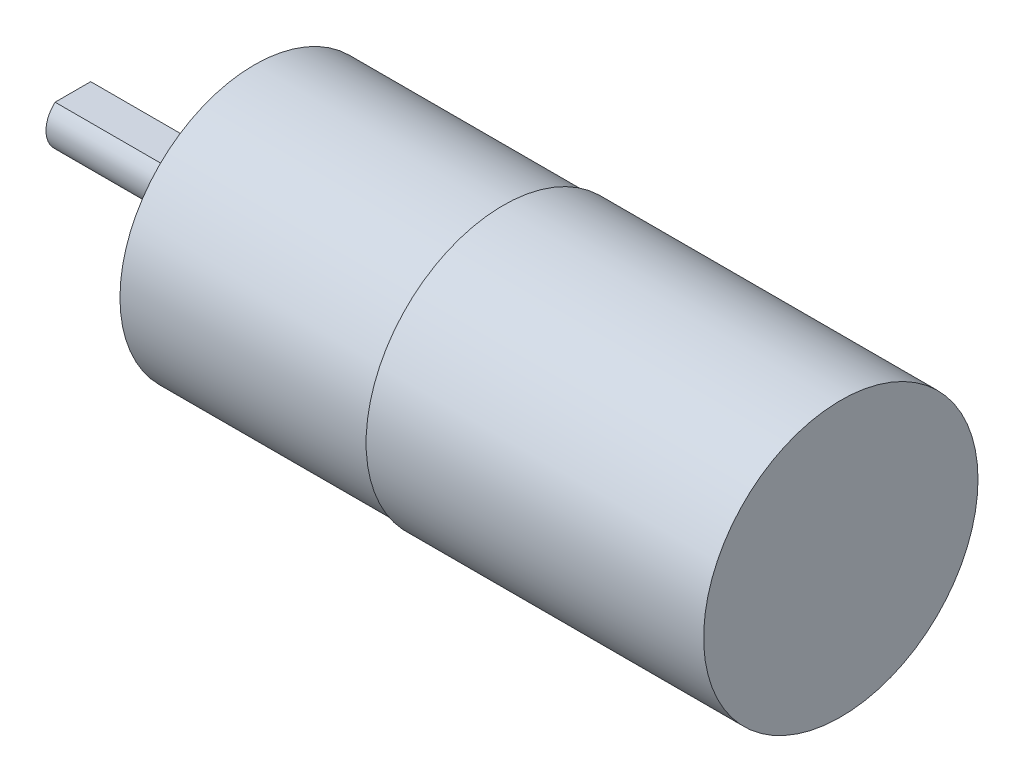
ISO-10303-21;
HEADER;
FILE_DESCRIPTION(('STEP AP214'),'2;1');
FILE_NAME('part.step','',(''),(''),'','','');
FILE_SCHEMA(('AUTOMOTIVE_DESIGN { 1 0 10303 214 1 1 1 1 }'));
ENDSEC;
DATA;
#1=APPLICATION_CONTEXT('core data for automotive mechanical design processes');
#2=APPLICATION_PROTOCOL_DEFINITION('international standard','automotive_design',2000,#1);
#3=PRODUCT_CONTEXT('',#1,'mechanical');
#4=PRODUCT('Part','Part','',(#3));
#5=PRODUCT_RELATED_PRODUCT_CATEGORY('part','',(#4));
#6=PRODUCT_DEFINITION_FORMATION('','',#4);
#7=PRODUCT_DEFINITION_CONTEXT('part definition',#1,'design');
#8=PRODUCT_DEFINITION('design','',#6,#7);
#9=PRODUCT_DEFINITION_SHAPE('','',#8);
#10=(LENGTH_UNIT() NAMED_UNIT(*) SI_UNIT(.MILLI.,.METRE.));
#11=(NAMED_UNIT(*) PLANE_ANGLE_UNIT() SI_UNIT($,.RADIAN.));
#12=(NAMED_UNIT(*) SI_UNIT($,.STERADIAN.) SOLID_ANGLE_UNIT());
#13=UNCERTAINTY_MEASURE_WITH_UNIT(LENGTH_MEASURE(1.E-05),#10,'distance_accuracy_value','');
#14=(GEOMETRIC_REPRESENTATION_CONTEXT(3) GLOBAL_UNCERTAINTY_ASSIGNED_CONTEXT((#13)) GLOBAL_UNIT_ASSIGNED_CONTEXT((#10,
#11,#12)) REPRESENTATION_CONTEXT('',''));
#15=CARTESIAN_POINT('',(0.,0.,0.));
#16=DIRECTION('',(0.,0.,1.));
#17=DIRECTION('',(1.,0.,0.));
#18=AXIS2_PLACEMENT_3D('',#15,#16,#17);
#19=CARTESIAN_POINT('',(-21.5,0.,0.));
#20=DIRECTION('',(-1.,0.,0.));
#21=DIRECTION('',(0.,0.,1.));
#22=AXIS2_PLACEMENT_3D('',#19,#20,#21);
#23=PLANE('',#22);
#24=CARTESIAN_POINT('',(-21.5,0.,0.));
#25=DIRECTION('',(-1.,0.,0.));
#26=DIRECTION('',(0.,0.,1.));
#27=AXIS2_PLACEMENT_3D('',#24,#25,#26);
#28=CIRCLE('',#27,3.5);
#29=CARTESIAN_POINT('',(-21.5,0.,3.5));
#30=VERTEX_POINT('',#29);
#31=EDGE_CURVE('E76',#30,#30,#28,.T.);
#32=ORIENTED_EDGE('',*,*,#31,.T.);
#33=EDGE_LOOP('',(#32));
#34=FACE_BOUND('',#33,.T.);
#35=CARTESIAN_POINT('',(-21.5,0.,0.));
#36=DIRECTION('',(-1.,0.,0.));
#37=DIRECTION('',(0.,0.,1.));
#38=AXIS2_PLACEMENT_3D('',#35,#36,#37);
#39=CIRCLE('',#38,2.);
#40=CARTESIAN_POINT('',(-21.5,1.5,-1.3228756555323));
#41=VERTEX_POINT('',#40);
#42=CARTESIAN_POINT('',(-21.5,1.5,1.3228756555323));
#43=VERTEX_POINT('',#42);
#44=EDGE_CURVE('E70',#41,#43,#39,.T.);
#45=ORIENTED_EDGE('',*,*,#44,.F.);
#46=DIRECTION('',(0.,0.,-1.));
#47=VECTOR('',#46,1.);
#48=CARTESIAN_POINT('',(-21.5,1.5,0.));
#49=LINE('',#48,#47);
#50=EDGE_CURVE('E52',#43,#41,#49,.T.);
#51=ORIENTED_EDGE('',*,*,#50,.F.);
#52=EDGE_LOOP('',(#45,#51));
#53=FACE_BOUND('',#52,.T.);
#54=ADVANCED_FACE('F32',(#34,#53),#23,.T.);
#55=CARTESIAN_POINT('',(-18.5,0.,0.));
#56=DIRECTION('',(-1.,0.,0.));
#57=DIRECTION('',(0.,0.,1.));
#58=AXIS2_PLACEMENT_3D('',#55,#56,#57);
#59=PLANE('',#58);
#60=CARTESIAN_POINT('',(-18.5,-7.5,0.));
#61=DIRECTION('',(-1.,0.,0.));
#62=DIRECTION('',(0.,0.,1.));
#63=AXIS2_PLACEMENT_3D('',#60,#61,#62);
#64=CIRCLE('',#63,1.25);
#65=CARTESIAN_POINT('',(-18.5,-7.5,1.25));
#66=VERTEX_POINT('',#65);
#67=EDGE_CURVE('E151',#66,#66,#64,.T.);
#68=ORIENTED_EDGE('',*,*,#67,.F.);
#69=EDGE_LOOP('',(#68));
#70=FACE_BOUND('',#69,.T.);
#71=CARTESIAN_POINT('',(-18.5,7.5,0.));
#72=DIRECTION('',(-1.,0.,0.));
#73=DIRECTION('',(0.,0.,1.));
#74=AXIS2_PLACEMENT_3D('',#71,#72,#73);
#75=CIRCLE('',#74,1.25);
#76=CARTESIAN_POINT('',(-18.5,7.5,1.25));
#77=VERTEX_POINT('',#76);
#78=EDGE_CURVE('E150',#77,#77,#75,.T.);
#79=ORIENTED_EDGE('',*,*,#78,.F.);
#80=EDGE_LOOP('',(#79));
#81=FACE_BOUND('',#80,.T.);
#82=CARTESIAN_POINT('',(-18.5,0.,0.));
#83=DIRECTION('',(-1.,0.,0.));
#84=DIRECTION('',(0.,0.,1.));
#85=AXIS2_PLACEMENT_3D('',#82,#83,#84);
#86=CIRCLE('',#85,10.);
#87=CARTESIAN_POINT('',(-18.5,0.,10.));
#88=VERTEX_POINT('',#87);
#89=EDGE_CURVE('E83',#88,#88,#86,.T.);
#90=ORIENTED_EDGE('',*,*,#89,.T.);
#91=EDGE_LOOP('',(#90));
#92=FACE_BOUND('',#91,.T.);
#93=CARTESIAN_POINT('',(-18.5,0.,0.));
#94=DIRECTION('',(-1.,0.,0.));
#95=DIRECTION('',(0.,0.,1.));
#96=AXIS2_PLACEMENT_3D('',#93,#94,#95);
#97=CIRCLE('',#96,3.5);
#98=CARTESIAN_POINT('',(-18.5,0.,3.5));
#99=VERTEX_POINT('',#98);
#100=EDGE_CURVE('E73',#99,#99,#97,.T.);
#101=ORIENTED_EDGE('',*,*,#100,.F.);
#102=EDGE_LOOP('',(#101));
#103=FACE_BOUND('',#102,.T.);
#104=ADVANCED_FACE('F96',(#70,#81,#92,#103),#59,.T.);
#105=CARTESIAN_POINT('',(0.,0.,0.));
#106=DIRECTION('',(1.,0.,0.));
#107=DIRECTION('',(0.,0.,-1.));
#108=AXIS2_PLACEMENT_3D('',#105,#106,#107);
#109=PLANE('',#108);
#110=CARTESIAN_POINT('',(0.,0.,0.));
#111=DIRECTION('',(1.,0.,0.));
#112=DIRECTION('',(0.,0.,-1.));
#113=AXIS2_PLACEMENT_3D('',#110,#111,#112);
#114=CIRCLE('',#113,10.2);
#115=CARTESIAN_POINT('',(0.,0.,-10.2));
#116=VERTEX_POINT('',#115);
#117=EDGE_CURVE('E87',#116,#116,#114,.T.);
#118=ORIENTED_EDGE('',*,*,#117,.F.);
#119=EDGE_LOOP('',(#118));
#120=FACE_BOUND('',#119,.T.);
#121=CARTESIAN_POINT('',(0.,0.,0.));
#122=DIRECTION('',(1.,0.,0.));
#123=DIRECTION('',(0.,0.,-1.));
#124=AXIS2_PLACEMENT_3D('',#121,#122,#123);
#125=CIRCLE('',#124,10.);
#126=CARTESIAN_POINT('',(0.,0.,-10.));
#127=VERTEX_POINT('',#126);
#128=EDGE_CURVE('E11',#127,#127,#125,.F.);
#129=ORIENTED_EDGE('',*,*,#128,.F.);
#130=EDGE_LOOP('',(#129));
#131=FACE_BOUND('',#130,.T.);
#132=ADVANCED_FACE('F93',(#120,#131),#109,.F.);
#133=CARTESIAN_POINT('',(25.1,0.,0.));
#134=DIRECTION('',(-1.,0.,0.));
#135=DIRECTION('',(0.,0.,1.));
#136=AXIS2_PLACEMENT_3D('',#133,#134,#135);
#137=CYLINDRICAL_SURFACE('',#136,10.2);
#138=CARTESIAN_POINT('',(25.1,0.,0.));
#139=DIRECTION('',(1.,0.,0.));
#140=DIRECTION('',(0.,0.,-1.));
#141=AXIS2_PLACEMENT_3D('',#138,#139,#140);
#142=CIRCLE('',#141,10.2);
#143=CARTESIAN_POINT('',(25.1,0.,-10.2));
#144=VERTEX_POINT('',#143);
#145=EDGE_CURVE('E40',#144,#144,#142,.T.);
#146=ORIENTED_EDGE('',*,*,#145,.F.);
#147=EDGE_LOOP('',(#146));
#148=FACE_BOUND('',#147,.T.);
#149=ORIENTED_EDGE('',*,*,#117,.T.);
#150=EDGE_LOOP('',(#149));
#151=FACE_BOUND('',#150,.T.);
#152=ADVANCED_FACE('F34',(#148,#151),#137,.T.);
#153=CARTESIAN_POINT('',(25.1,0.,0.));
#154=DIRECTION('',(1.,0.,0.));
#155=DIRECTION('',(0.,0.,-1.));
#156=AXIS2_PLACEMENT_3D('',#153,#154,#155);
#157=PLANE('',#156);
#158=ORIENTED_EDGE('',*,*,#145,.T.);
#159=EDGE_LOOP('',(#158));
#160=FACE_BOUND('',#159,.T.);
#161=ADVANCED_FACE('F102',(#160),#157,.T.);
#162=CARTESIAN_POINT('',(-18.5,0.,0.));
#163=DIRECTION('',(1.,0.,0.));
#164=DIRECTION('',(0.,0.,-1.));
#165=AXIS2_PLACEMENT_3D('',#162,#163,#164);
#166=CYLINDRICAL_SURFACE('',#165,10.);
#167=ORIENTED_EDGE('',*,*,#89,.F.);
#168=EDGE_LOOP('',(#167));
#169=FACE_BOUND('',#168,.T.);
#170=ORIENTED_EDGE('',*,*,#128,.T.);
#171=EDGE_LOOP('',(#170));
#172=FACE_BOUND('',#171,.T.);
#173=ADVANCED_FACE('F99',(#169,#172),#166,.T.);
#174=CARTESIAN_POINT('',(-21.5,0.,0.));
#175=DIRECTION('',(1.,0.,0.));
#176=DIRECTION('',(0.,0.,-1.));
#177=AXIS2_PLACEMENT_3D('',#174,#175,#176);
#178=CYLINDRICAL_SURFACE('',#177,3.5);
#179=ORIENTED_EDGE('',*,*,#31,.F.);
#180=EDGE_LOOP('',(#179));
#181=FACE_BOUND('',#180,.T.);
#182=ORIENTED_EDGE('',*,*,#100,.T.);
#183=EDGE_LOOP('',(#182));
#184=FACE_BOUND('',#183,.T.);
#185=ADVANCED_FACE('F101',(#181,#184),#178,.T.);
#186=CARTESIAN_POINT('',(-32.,0.,0.));
#187=DIRECTION('',(1.,0.,0.));
#188=DIRECTION('',(0.,0.,-1.));
#189=AXIS2_PLACEMENT_3D('',#186,#187,#188);
#190=CYLINDRICAL_SURFACE('',#189,2.);
#191=CARTESIAN_POINT('',(-32.,0.,0.));
#192=DIRECTION('',(-1.,0.,0.));
#193=DIRECTION('',(0.,0.,1.));
#194=AXIS2_PLACEMENT_3D('',#191,#192,#193);
#195=CIRCLE('',#194,2.);
#196=CARTESIAN_POINT('',(-32.,1.5,-1.3228756555323));
#197=VERTEX_POINT('',#196);
#198=CARTESIAN_POINT('',(-32.,1.5,1.3228756555323));
#199=VERTEX_POINT('',#198);
#200=EDGE_CURVE('E68',#197,#199,#195,.T.);
#201=ORIENTED_EDGE('',*,*,#200,.F.);
#202=DIRECTION('',(-1.,0.,0.));
#203=VECTOR('',#202,1.);
#204=CARTESIAN_POINT('',(-18.8074175964327,1.5,-1.3228756555323));
#205=LINE('',#204,#203);
#206=EDGE_CURVE('E47',#41,#197,#205,.T.);
#207=ORIENTED_EDGE('',*,*,#206,.F.);
#208=ORIENTED_EDGE('',*,*,#44,.T.);
#209=DIRECTION('',(-1.,0.,0.));
#210=VECTOR('',#209,1.);
#211=CARTESIAN_POINT('',(-18.8074175964327,1.5,1.3228756555323));
#212=LINE('',#211,#210);
#213=EDGE_CURVE('E59',#43,#199,#212,.T.);
#214=ORIENTED_EDGE('',*,*,#213,.T.);
#215=EDGE_LOOP('',(#201,#207,#208,#214));
#216=FACE_BOUND('',#215,.T.);
#217=ADVANCED_FACE('F67',(#216),#190,.T.);
#218=CARTESIAN_POINT('',(-32.,0.,0.));
#219=DIRECTION('',(-1.,0.,0.));
#220=DIRECTION('',(0.,0.,1.));
#221=AXIS2_PLACEMENT_3D('',#218,#219,#220);
#222=PLANE('',#221);
#223=DIRECTION('',(0.,0.,1.));
#224=VECTOR('',#223,1.);
#225=CARTESIAN_POINT('',(-32.,1.5,0.));
#226=LINE('',#225,#224);
#227=EDGE_CURVE('E56',#197,#199,#226,.T.);
#228=ORIENTED_EDGE('',*,*,#227,.F.);
#229=ORIENTED_EDGE('',*,*,#200,.T.);
#230=EDGE_LOOP('',(#228,#229));
#231=FACE_BOUND('',#230,.T.);
#232=ADVANCED_FACE('F72',(#231),#222,.T.);
#233=CARTESIAN_POINT('',(-18.8074175964327,1.5,0.));
#234=DIRECTION('',(0.,-1.,0.));
#235=DIRECTION('',(0.,0.,-1.));
#236=AXIS2_PLACEMENT_3D('',#233,#234,#235);
#237=PLANE('',#236);
#238=ORIENTED_EDGE('',*,*,#50,.T.);
#239=ORIENTED_EDGE('',*,*,#206,.T.);
#240=ORIENTED_EDGE('',*,*,#227,.T.);
#241=ORIENTED_EDGE('',*,*,#213,.F.);
#242=EDGE_LOOP('',(#238,#239,#240,#241));
#243=FACE_BOUND('',#242,.T.);
#244=ADVANCED_FACE('F58',(#243),#237,.F.);
#245=CARTESIAN_POINT('',(-15.5,7.5,0.));
#246=DIRECTION('',(-1.,0.,0.));
#247=DIRECTION('',(0.,0.,1.));
#248=AXIS2_PLACEMENT_3D('',#245,#246,#247);
#249=CYLINDRICAL_SURFACE('',#248,1.25);
#250=CARTESIAN_POINT('',(-15.5,7.5,0.));
#251=DIRECTION('',(-1.,0.,0.));
#252=DIRECTION('',(0.,0.,1.));
#253=AXIS2_PLACEMENT_3D('',#250,#251,#252);
#254=CIRCLE('',#253,1.25);
#255=CARTESIAN_POINT('',(-15.5,7.5,1.25));
#256=VERTEX_POINT('',#255);
#257=EDGE_CURVE('E63',#256,#256,#254,.T.);
#258=ORIENTED_EDGE('',*,*,#257,.F.);
#259=EDGE_LOOP('',(#258));
#260=FACE_BOUND('',#259,.T.);
#261=ORIENTED_EDGE('',*,*,#78,.T.);
#262=EDGE_LOOP('',(#261));
#263=FACE_BOUND('',#262,.T.);
#264=ADVANCED_FACE('F130',(#260,#263),#249,.F.);
#265=CARTESIAN_POINT('',(-15.5,7.5,0.));
#266=DIRECTION('',(-1.,0.,0.));
#267=DIRECTION('',(0.,0.,1.));
#268=AXIS2_PLACEMENT_3D('',#265,#266,#267);
#269=PLANE('',#268);
#270=ORIENTED_EDGE('',*,*,#257,.T.);
#271=EDGE_LOOP('',(#270));
#272=FACE_BOUND('',#271,.T.);
#273=ADVANCED_FACE('F133',(#272),#269,.T.);
#274=CARTESIAN_POINT('',(-15.5,-7.5,0.));
#275=DIRECTION('',(-1.,0.,0.));
#276=DIRECTION('',(0.,0.,1.));
#277=AXIS2_PLACEMENT_3D('',#274,#275,#276);
#278=CYLINDRICAL_SURFACE('',#277,1.25);
#279=CARTESIAN_POINT('',(-15.5,-7.5,0.));
#280=DIRECTION('',(-1.,0.,0.));
#281=DIRECTION('',(0.,0.,1.));
#282=AXIS2_PLACEMENT_3D('',#279,#280,#281);
#283=CIRCLE('',#282,1.25);
#284=CARTESIAN_POINT('',(-15.5,-7.5,1.25));
#285=VERTEX_POINT('',#284);
#286=EDGE_CURVE('E149',#285,#285,#283,.T.);
#287=ORIENTED_EDGE('',*,*,#286,.F.);
#288=EDGE_LOOP('',(#287));
#289=FACE_BOUND('',#288,.T.);
#290=ORIENTED_EDGE('',*,*,#67,.T.);
#291=EDGE_LOOP('',(#290));
#292=FACE_BOUND('',#291,.T.);
#293=ADVANCED_FACE('F137',(#289,#292),#278,.F.);
#294=CARTESIAN_POINT('',(-15.5,-7.5,0.));
#295=DIRECTION('',(-1.,0.,0.));
#296=DIRECTION('',(0.,0.,1.));
#297=AXIS2_PLACEMENT_3D('',#294,#295,#296);
#298=PLANE('',#297);
#299=ORIENTED_EDGE('',*,*,#286,.T.);
#300=EDGE_LOOP('',(#299));
#301=FACE_BOUND('',#300,.T.);
#302=ADVANCED_FACE('F141',(#301),#298,.T.);
#303=CLOSED_SHELL('',(#54,#104,#132,#152,#161,#173,#185,#217,#232,#244,#264,#273,#293,#302));
#304=MANIFOLD_SOLID_BREP('B2',#303);
#305=ADVANCED_BREP_SHAPE_REPRESENTATION('',(#18,#304),#14);
#306=SHAPE_DEFINITION_REPRESENTATION(#9,#305);
ENDSEC;
END-ISO-10303-21;
